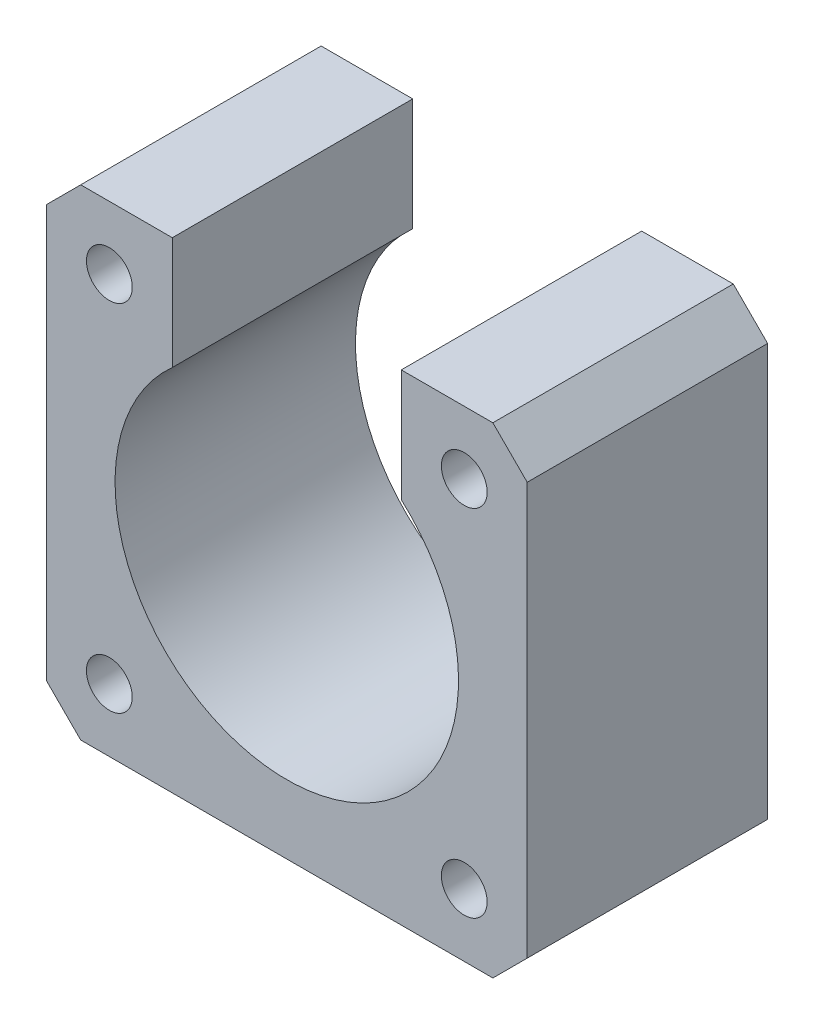
ISO-10303-21;
HEADER;
FILE_DESCRIPTION(('STEP AP214'),'2;1');
FILE_NAME('part.step','',(''),(''),'','','');
FILE_SCHEMA(('AUTOMOTIVE_DESIGN { 1 0 10303 214 1 1 1 1 }'));
ENDSEC;
DATA;
#1=APPLICATION_CONTEXT('core data for automotive mechanical design processes');
#2=APPLICATION_PROTOCOL_DEFINITION('international standard','automotive_design',2000,#1);
#3=PRODUCT_CONTEXT('',#1,'mechanical');
#4=PRODUCT('Part','Part','',(#3));
#5=PRODUCT_RELATED_PRODUCT_CATEGORY('part','',(#4));
#6=PRODUCT_DEFINITION_FORMATION('','',#4);
#7=PRODUCT_DEFINITION_CONTEXT('part definition',#1,'design');
#8=PRODUCT_DEFINITION('design','',#6,#7);
#9=PRODUCT_DEFINITION_SHAPE('','',#8);
#10=(LENGTH_UNIT() NAMED_UNIT(*) SI_UNIT(.MILLI.,.METRE.));
#11=(NAMED_UNIT(*) PLANE_ANGLE_UNIT() SI_UNIT($,.RADIAN.));
#12=(NAMED_UNIT(*) SI_UNIT($,.STERADIAN.) SOLID_ANGLE_UNIT());
#13=UNCERTAINTY_MEASURE_WITH_UNIT(LENGTH_MEASURE(1.E-05),#10,'distance_accuracy_value','');
#14=(GEOMETRIC_REPRESENTATION_CONTEXT(3) GLOBAL_UNCERTAINTY_ASSIGNED_CONTEXT((#13)) GLOBAL_UNIT_ASSIGNED_CONTEXT((#10,
#11,#12)) REPRESENTATION_CONTEXT('',''));
#15=CARTESIAN_POINT('',(0.,0.,0.));
#16=DIRECTION('',(0.,0.,1.));
#17=DIRECTION('',(1.,0.,0.));
#18=AXIS2_PLACEMENT_3D('',#15,#16,#17);
#19=CARTESIAN_POINT('',(0.,0.,21.));
#20=DIRECTION('',(0.,0.,1.));
#21=DIRECTION('',(1.,0.,0.));
#22=AXIS2_PLACEMENT_3D('',#19,#20,#21);
#23=PLANE('',#22);
#24=CARTESIAN_POINT('',(-15.5,-15.5,21.));
#25=DIRECTION('',(0.,0.,1.));
#26=DIRECTION('',(1.,0.,0.));
#27=AXIS2_PLACEMENT_3D('',#24,#25,#26);
#28=CIRCLE('',#27,2.);
#29=CARTESIAN_POINT('',(-17.5,-15.5,21.));
#30=VERTEX_POINT('',#29);
#31=EDGE_CURVE('E293',#30,#30,#28,.T.);
#32=ORIENTED_EDGE('',*,*,#31,.F.);
#33=EDGE_LOOP('',(#32));
#34=FACE_BOUND('',#33,.T.);
#35=CARTESIAN_POINT('',(15.5,15.5,21.));
#36=DIRECTION('',(0.,0.,1.));
#37=DIRECTION('',(1.,0.,0.));
#38=AXIS2_PLACEMENT_3D('',#35,#36,#37);
#39=CIRCLE('',#38,2.);
#40=CARTESIAN_POINT('',(13.5,15.5,21.));
#41=VERTEX_POINT('',#40);
#42=EDGE_CURVE('E159',#41,#41,#39,.T.);
#43=ORIENTED_EDGE('',*,*,#42,.F.);
#44=EDGE_LOOP('',(#43));
#45=FACE_BOUND('',#44,.T.);
#46=DIRECTION('',(0.,-1.,0.));
#47=VECTOR('',#46,1.);
#48=CARTESIAN_POINT('',(-21.,-18.,21.));
#49=LINE('',#48,#47);
#50=CARTESIAN_POINT('',(-21.,18.,21.));
#51=VERTEX_POINT('',#50);
#52=CARTESIAN_POINT('',(-21.,-18.,21.));
#53=VERTEX_POINT('',#52);
#54=EDGE_CURVE('E178',#51,#53,#49,.T.);
#55=ORIENTED_EDGE('',*,*,#54,.T.);
#56=DIRECTION('',(0.707106781186548,-0.707106781186548,0.));
#57=VECTOR('',#56,1.);
#58=CARTESIAN_POINT('',(-21.,-18.,21.));
#59=LINE('',#58,#57);
#60=CARTESIAN_POINT('',(-18.,-21.,21.));
#61=VERTEX_POINT('',#60);
#62=EDGE_CURVE('E106',#53,#61,#59,.T.);
#63=ORIENTED_EDGE('',*,*,#62,.T.);
#64=DIRECTION('',(1.,0.,0.));
#65=VECTOR('',#64,1.);
#66=CARTESIAN_POINT('',(-18.,-21.,21.));
#67=LINE('',#66,#65);
#68=CARTESIAN_POINT('',(18.,-21.,21.));
#69=VERTEX_POINT('',#68);
#70=EDGE_CURVE('E205',#61,#69,#67,.T.);
#71=ORIENTED_EDGE('',*,*,#70,.T.);
#72=DIRECTION('',(0.707106781186548,0.707106781186548,0.));
#73=VECTOR('',#72,1.);
#74=CARTESIAN_POINT('',(18.,-21.,21.));
#75=LINE('',#74,#73);
#76=CARTESIAN_POINT('',(21.,-18.,21.));
#77=VERTEX_POINT('',#76);
#78=EDGE_CURVE('E224',#69,#77,#75,.T.);
#79=ORIENTED_EDGE('',*,*,#78,.T.);
#80=DIRECTION('',(0.,1.,0.));
#81=VECTOR('',#80,1.);
#82=CARTESIAN_POINT('',(21.,-18.,21.));
#83=LINE('',#82,#81);
#84=CARTESIAN_POINT('',(21.,18.,21.));
#85=VERTEX_POINT('',#84);
#86=EDGE_CURVE('E221',#77,#85,#83,.T.);
#87=ORIENTED_EDGE('',*,*,#86,.T.);
#88=DIRECTION('',(-0.707106781186548,0.707106781186548,0.));
#89=VECTOR('',#88,1.);
#90=CARTESIAN_POINT('',(18.,21.,21.));
#91=LINE('',#90,#89);
#92=CARTESIAN_POINT('',(18.,21.,21.));
#93=VERTEX_POINT('',#92);
#94=EDGE_CURVE('E223',#85,#93,#91,.T.);
#95=ORIENTED_EDGE('',*,*,#94,.T.);
#96=DIRECTION('',(-1.,0.,0.));
#97=VECTOR('',#96,1.);
#98=CARTESIAN_POINT('',(10.,21.,21.));
#99=LINE('',#98,#97);
#100=CARTESIAN_POINT('',(10.,21.,21.));
#101=VERTEX_POINT('',#100);
#102=EDGE_CURVE('E226',#93,#101,#99,.T.);
#103=ORIENTED_EDGE('',*,*,#102,.T.);
#104=DIRECTION('',(0.,-1.,0.));
#105=VECTOR('',#104,1.);
#106=CARTESIAN_POINT('',(10.,21.,21.));
#107=LINE('',#106,#105);
#108=CARTESIAN_POINT('',(10.,11.180339887499,21.));
#109=VERTEX_POINT('',#108);
#110=EDGE_CURVE('E232',#101,#109,#107,.T.);
#111=ORIENTED_EDGE('',*,*,#110,.T.);
#112=CARTESIAN_POINT('',(0.,0.,21.));
#113=DIRECTION('',(0.,0.,-1.));
#114=DIRECTION('',(1.,0.,0.));
#115=AXIS2_PLACEMENT_3D('',#112,#113,#114);
#116=CIRCLE('',#115,15.);
#117=CARTESIAN_POINT('',(-10.,11.180339887499,21.));
#118=VERTEX_POINT('',#117);
#119=EDGE_CURVE('E137',#109,#118,#116,.T.);
#120=ORIENTED_EDGE('',*,*,#119,.T.);
#121=DIRECTION('',(0.,1.,0.));
#122=VECTOR('',#121,1.);
#123=CARTESIAN_POINT('',(-10.,21.,21.));
#124=LINE('',#123,#122);
#125=CARTESIAN_POINT('',(-10.,21.,21.));
#126=VERTEX_POINT('',#125);
#127=EDGE_CURVE('E131',#118,#126,#124,.T.);
#128=ORIENTED_EDGE('',*,*,#127,.T.);
#129=DIRECTION('',(-1.,0.,0.));
#130=VECTOR('',#129,1.);
#131=CARTESIAN_POINT('',(-18.,21.,21.));
#132=LINE('',#131,#130);
#133=CARTESIAN_POINT('',(-18.,21.,21.));
#134=VERTEX_POINT('',#133);
#135=EDGE_CURVE('E135',#126,#134,#132,.T.);
#136=ORIENTED_EDGE('',*,*,#135,.T.);
#137=DIRECTION('',(-0.707106781186548,-0.707106781186548,0.));
#138=VECTOR('',#137,1.);
#139=CARTESIAN_POINT('',(-21.,18.,21.));
#140=LINE('',#139,#138);
#141=EDGE_CURVE('E51',#134,#51,#140,.T.);
#142=ORIENTED_EDGE('',*,*,#141,.T.);
#143=EDGE_LOOP('',(#55,#63,#71,#79,#87,#95,#103,#111,#120,#128,#136,#142));
#144=FACE_BOUND('',#143,.T.);
#145=CARTESIAN_POINT('',(15.5,-15.5,21.));
#146=DIRECTION('',(0.,0.,1.));
#147=DIRECTION('',(1.,0.,0.));
#148=AXIS2_PLACEMENT_3D('',#145,#146,#147);
#149=CIRCLE('',#148,2.);
#150=CARTESIAN_POINT('',(13.5,-15.5,21.));
#151=VERTEX_POINT('',#150);
#152=EDGE_CURVE('E299',#151,#151,#149,.T.);
#153=ORIENTED_EDGE('',*,*,#152,.F.);
#154=EDGE_LOOP('',(#153));
#155=FACE_BOUND('',#154,.T.);
#156=CARTESIAN_POINT('',(-15.5,15.5,21.));
#157=DIRECTION('',(0.,0.,1.));
#158=DIRECTION('',(1.,0.,0.));
#159=AXIS2_PLACEMENT_3D('',#156,#157,#158);
#160=CIRCLE('',#159,2.);
#161=CARTESIAN_POINT('',(-17.5,15.5,21.));
#162=VERTEX_POINT('',#161);
#163=EDGE_CURVE('E284',#162,#162,#160,.T.);
#164=ORIENTED_EDGE('',*,*,#163,.F.);
#165=EDGE_LOOP('',(#164));
#166=FACE_BOUND('',#165,.T.);
#167=ADVANCED_FACE('F34',(#34,#45,#144,#155,#166),#23,.T.);
#168=CARTESIAN_POINT('',(0.,0.,0.));
#169=DIRECTION('',(0.,0.,1.));
#170=DIRECTION('',(1.,0.,0.));
#171=AXIS2_PLACEMENT_3D('',#168,#169,#170);
#172=PLANE('',#171);
#173=CARTESIAN_POINT('',(-15.5,-15.5,0.));
#174=DIRECTION('',(0.,0.,1.));
#175=DIRECTION('',(1.,0.,0.));
#176=AXIS2_PLACEMENT_3D('',#173,#174,#175);
#177=CIRCLE('',#176,2.);
#178=CARTESIAN_POINT('',(-17.5,-15.5,0.));
#179=VERTEX_POINT('',#178);
#180=EDGE_CURVE('E290',#179,#179,#177,.T.);
#181=ORIENTED_EDGE('',*,*,#180,.T.);
#182=EDGE_LOOP('',(#181));
#183=FACE_BOUND('',#182,.T.);
#184=CARTESIAN_POINT('',(15.5,15.5,0.));
#185=DIRECTION('',(0.,0.,1.));
#186=DIRECTION('',(1.,0.,0.));
#187=AXIS2_PLACEMENT_3D('',#184,#185,#186);
#188=CIRCLE('',#187,2.);
#189=CARTESIAN_POINT('',(13.5,15.5,0.));
#190=VERTEX_POINT('',#189);
#191=EDGE_CURVE('E302',#190,#190,#188,.T.);
#192=ORIENTED_EDGE('',*,*,#191,.T.);
#193=EDGE_LOOP('',(#192));
#194=FACE_BOUND('',#193,.T.);
#195=DIRECTION('',(0.,-1.,0.));
#196=VECTOR('',#195,1.);
#197=CARTESIAN_POINT('',(-21.,-18.,0.));
#198=LINE('',#197,#196);
#199=CARTESIAN_POINT('',(-21.,18.,0.));
#200=VERTEX_POINT('',#199);
#201=CARTESIAN_POINT('',(-21.,-18.,0.));
#202=VERTEX_POINT('',#201);
#203=EDGE_CURVE('E155',#200,#202,#198,.T.);
#204=ORIENTED_EDGE('',*,*,#203,.F.);
#205=DIRECTION('',(-0.707106781186548,-0.707106781186548,0.));
#206=VECTOR('',#205,1.);
#207=CARTESIAN_POINT('',(-21.,18.,0.));
#208=LINE('',#207,#206);
#209=CARTESIAN_POINT('',(-18.,21.,0.));
#210=VERTEX_POINT('',#209);
#211=EDGE_CURVE('E98',#210,#200,#208,.T.);
#212=ORIENTED_EDGE('',*,*,#211,.F.);
#213=DIRECTION('',(-1.,0.,0.));
#214=VECTOR('',#213,1.);
#215=CARTESIAN_POINT('',(-18.,21.,0.));
#216=LINE('',#215,#214);
#217=CARTESIAN_POINT('',(-10.,21.,0.));
#218=VERTEX_POINT('',#217);
#219=EDGE_CURVE('E92',#218,#210,#216,.T.);
#220=ORIENTED_EDGE('',*,*,#219,.F.);
#221=DIRECTION('',(0.,1.,0.));
#222=VECTOR('',#221,1.);
#223=CARTESIAN_POINT('',(-10.,21.,0.));
#224=LINE('',#223,#222);
#225=CARTESIAN_POINT('',(-10.,11.180339887499,0.));
#226=VERTEX_POINT('',#225);
#227=EDGE_CURVE('E145',#226,#218,#224,.T.);
#228=ORIENTED_EDGE('',*,*,#227,.F.);
#229=CARTESIAN_POINT('',(0.,0.,0.));
#230=DIRECTION('',(0.,0.,-1.));
#231=DIRECTION('',(1.,0.,0.));
#232=AXIS2_PLACEMENT_3D('',#229,#230,#231);
#233=CIRCLE('',#232,15.);
#234=CARTESIAN_POINT('',(10.,11.180339887499,0.));
#235=VERTEX_POINT('',#234);
#236=EDGE_CURVE('E173',#235,#226,#233,.T.);
#237=ORIENTED_EDGE('',*,*,#236,.F.);
#238=DIRECTION('',(0.,-1.,0.));
#239=VECTOR('',#238,1.);
#240=CARTESIAN_POINT('',(10.,21.,0.));
#241=LINE('',#240,#239);
#242=CARTESIAN_POINT('',(10.,21.,0.));
#243=VERTEX_POINT('',#242);
#244=EDGE_CURVE('E171',#243,#235,#241,.T.);
#245=ORIENTED_EDGE('',*,*,#244,.F.);
#246=DIRECTION('',(-1.,0.,0.));
#247=VECTOR('',#246,1.);
#248=CARTESIAN_POINT('',(10.,21.,0.));
#249=LINE('',#248,#247);
#250=CARTESIAN_POINT('',(18.,21.,0.));
#251=VERTEX_POINT('',#250);
#252=EDGE_CURVE('E169',#251,#243,#249,.T.);
#253=ORIENTED_EDGE('',*,*,#252,.F.);
#254=DIRECTION('',(-0.707106781186548,0.707106781186548,0.));
#255=VECTOR('',#254,1.);
#256=CARTESIAN_POINT('',(18.,21.,0.));
#257=LINE('',#256,#255);
#258=CARTESIAN_POINT('',(21.,18.,0.));
#259=VERTEX_POINT('',#258);
#260=EDGE_CURVE('E167',#259,#251,#257,.T.);
#261=ORIENTED_EDGE('',*,*,#260,.F.);
#262=DIRECTION('',(0.,1.,0.));
#263=VECTOR('',#262,1.);
#264=CARTESIAN_POINT('',(21.,-18.,0.));
#265=LINE('',#264,#263);
#266=CARTESIAN_POINT('',(21.,-18.,0.));
#267=VERTEX_POINT('',#266);
#268=EDGE_CURVE('E165',#267,#259,#265,.T.);
#269=ORIENTED_EDGE('',*,*,#268,.F.);
#270=DIRECTION('',(0.707106781186548,0.707106781186548,0.));
#271=VECTOR('',#270,1.);
#272=CARTESIAN_POINT('',(18.,-21.,0.));
#273=LINE('',#272,#271);
#274=CARTESIAN_POINT('',(18.,-21.,0.));
#275=VERTEX_POINT('',#274);
#276=EDGE_CURVE('E163',#275,#267,#273,.T.);
#277=ORIENTED_EDGE('',*,*,#276,.F.);
#278=DIRECTION('',(1.,0.,0.));
#279=VECTOR('',#278,1.);
#280=CARTESIAN_POINT('',(-18.,-21.,0.));
#281=LINE('',#280,#279);
#282=CARTESIAN_POINT('',(-18.,-21.,0.));
#283=VERTEX_POINT('',#282);
#284=EDGE_CURVE('E161',#283,#275,#281,.T.);
#285=ORIENTED_EDGE('',*,*,#284,.F.);
#286=DIRECTION('',(0.707106781186548,-0.707106781186548,0.));
#287=VECTOR('',#286,1.);
#288=CARTESIAN_POINT('',(-21.,-18.,0.));
#289=LINE('',#288,#287);
#290=EDGE_CURVE('E158',#202,#283,#289,.T.);
#291=ORIENTED_EDGE('',*,*,#290,.F.);
#292=EDGE_LOOP('',(#204,#212,#220,#228,#237,#245,#253,#261,#269,#277,#285,#291));
#293=FACE_BOUND('',#292,.T.);
#294=CARTESIAN_POINT('',(15.5,-15.5,0.));
#295=DIRECTION('',(0.,0.,1.));
#296=DIRECTION('',(1.,0.,0.));
#297=AXIS2_PLACEMENT_3D('',#294,#295,#296);
#298=CIRCLE('',#297,2.);
#299=CARTESIAN_POINT('',(13.5,-15.5,0.));
#300=VERTEX_POINT('',#299);
#301=EDGE_CURVE('E296',#300,#300,#298,.T.);
#302=ORIENTED_EDGE('',*,*,#301,.T.);
#303=EDGE_LOOP('',(#302));
#304=FACE_BOUND('',#303,.T.);
#305=CARTESIAN_POINT('',(-15.5,15.5,0.));
#306=DIRECTION('',(0.,0.,1.));
#307=DIRECTION('',(1.,0.,0.));
#308=AXIS2_PLACEMENT_3D('',#305,#306,#307);
#309=CIRCLE('',#308,2.);
#310=CARTESIAN_POINT('',(-17.5,15.5,0.));
#311=VERTEX_POINT('',#310);
#312=EDGE_CURVE('E287',#311,#311,#309,.T.);
#313=ORIENTED_EDGE('',*,*,#312,.T.);
#314=EDGE_LOOP('',(#313));
#315=FACE_BOUND('',#314,.T.);
#316=ADVANCED_FACE('F209',(#183,#194,#293,#304,#315),#172,.F.);
#317=CARTESIAN_POINT('',(-21.,-18.,21.));
#318=DIRECTION('',(1.,0.,0.));
#319=DIRECTION('',(0.,0.,-1.));
#320=AXIS2_PLACEMENT_3D('',#317,#318,#319);
#321=PLANE('',#320);
#322=ORIENTED_EDGE('',*,*,#203,.T.);
#323=DIRECTION('',(0.,0.,-1.));
#324=VECTOR('',#323,1.);
#325=CARTESIAN_POINT('',(-21.,-18.,21.));
#326=LINE('',#325,#324);
#327=EDGE_CURVE('E11',#53,#202,#326,.T.);
#328=ORIENTED_EDGE('',*,*,#327,.F.);
#329=ORIENTED_EDGE('',*,*,#54,.F.);
#330=DIRECTION('',(0.,0.,-1.));
#331=VECTOR('',#330,1.);
#332=CARTESIAN_POINT('',(-21.,18.,21.));
#333=LINE('',#332,#331);
#334=EDGE_CURVE('E151',#51,#200,#333,.T.);
#335=ORIENTED_EDGE('',*,*,#334,.T.);
#336=EDGE_LOOP('',(#322,#328,#329,#335));
#337=FACE_BOUND('',#336,.T.);
#338=ADVANCED_FACE('F36',(#337),#321,.F.);
#339=CARTESIAN_POINT('',(-21.,-18.,21.));
#340=DIRECTION('',(0.707106781186547,0.707106781186547,0.));
#341=DIRECTION('',(-0.707106781186548,0.707106781186548,0.));
#342=AXIS2_PLACEMENT_3D('',#339,#340,#341);
#343=PLANE('',#342);
#344=ORIENTED_EDGE('',*,*,#290,.T.);
#345=DIRECTION('',(0.,0.,-1.));
#346=VECTOR('',#345,1.);
#347=CARTESIAN_POINT('',(-18.,-21.,21.));
#348=LINE('',#347,#346);
#349=EDGE_CURVE('E43',#61,#283,#348,.T.);
#350=ORIENTED_EDGE('',*,*,#349,.F.);
#351=ORIENTED_EDGE('',*,*,#62,.F.);
#352=ORIENTED_EDGE('',*,*,#327,.T.);
#353=EDGE_LOOP('',(#344,#350,#351,#352));
#354=FACE_BOUND('',#353,.T.);
#355=ADVANCED_FACE('F411',(#354),#343,.F.);
#356=CARTESIAN_POINT('',(-18.,-21.,21.));
#357=DIRECTION('',(0.,1.,0.));
#358=DIRECTION('',(0.,0.,1.));
#359=AXIS2_PLACEMENT_3D('',#356,#357,#358);
#360=PLANE('',#359);
#361=ORIENTED_EDGE('',*,*,#284,.T.);
#362=DIRECTION('',(0.,0.,-1.));
#363=VECTOR('',#362,1.);
#364=CARTESIAN_POINT('',(18.,-21.,21.));
#365=LINE('',#364,#363);
#366=EDGE_CURVE('E197',#69,#275,#365,.T.);
#367=ORIENTED_EDGE('',*,*,#366,.F.);
#368=ORIENTED_EDGE('',*,*,#70,.F.);
#369=ORIENTED_EDGE('',*,*,#349,.T.);
#370=EDGE_LOOP('',(#361,#367,#368,#369));
#371=FACE_BOUND('',#370,.T.);
#372=ADVANCED_FACE('F203',(#371),#360,.F.);
#373=CARTESIAN_POINT('',(18.,-21.,21.));
#374=DIRECTION('',(-0.707106781186547,0.707106781186547,0.));
#375=DIRECTION('',(-0.707106781186548,-0.707106781186548,0.));
#376=AXIS2_PLACEMENT_3D('',#373,#374,#375);
#377=PLANE('',#376);
#378=ORIENTED_EDGE('',*,*,#276,.T.);
#379=DIRECTION('',(0.,0.,-1.));
#380=VECTOR('',#379,1.);
#381=CARTESIAN_POINT('',(21.,-18.,21.));
#382=LINE('',#381,#380);
#383=EDGE_CURVE('E194',#77,#267,#382,.T.);
#384=ORIENTED_EDGE('',*,*,#383,.F.);
#385=ORIENTED_EDGE('',*,*,#78,.F.);
#386=ORIENTED_EDGE('',*,*,#366,.T.);
#387=EDGE_LOOP('',(#378,#384,#385,#386));
#388=FACE_BOUND('',#387,.T.);
#389=ADVANCED_FACE('F215',(#388),#377,.F.);
#390=CARTESIAN_POINT('',(21.,-18.,21.));
#391=DIRECTION('',(-1.,0.,0.));
#392=DIRECTION('',(0.,0.,1.));
#393=AXIS2_PLACEMENT_3D('',#390,#391,#392);
#394=PLANE('',#393);
#395=ORIENTED_EDGE('',*,*,#268,.T.);
#396=DIRECTION('',(0.,0.,-1.));
#397=VECTOR('',#396,1.);
#398=CARTESIAN_POINT('',(21.,18.,21.));
#399=LINE('',#398,#397);
#400=EDGE_CURVE('E191',#85,#259,#399,.T.);
#401=ORIENTED_EDGE('',*,*,#400,.F.);
#402=ORIENTED_EDGE('',*,*,#86,.F.);
#403=ORIENTED_EDGE('',*,*,#383,.T.);
#404=EDGE_LOOP('',(#395,#401,#402,#403));
#405=FACE_BOUND('',#404,.T.);
#406=ADVANCED_FACE('F219',(#405),#394,.F.);
#407=CARTESIAN_POINT('',(18.,21.,21.));
#408=DIRECTION('',(-0.707106781186547,-0.707106781186547,0.));
#409=DIRECTION('',(0.707106781186548,-0.707106781186548,0.));
#410=AXIS2_PLACEMENT_3D('',#407,#408,#409);
#411=PLANE('',#410);
#412=ORIENTED_EDGE('',*,*,#260,.T.);
#413=DIRECTION('',(0.,0.,-1.));
#414=VECTOR('',#413,1.);
#415=CARTESIAN_POINT('',(18.,21.,21.));
#416=LINE('',#415,#414);
#417=EDGE_CURVE('E188',#93,#251,#416,.T.);
#418=ORIENTED_EDGE('',*,*,#417,.F.);
#419=ORIENTED_EDGE('',*,*,#94,.F.);
#420=ORIENTED_EDGE('',*,*,#400,.T.);
#421=EDGE_LOOP('',(#412,#418,#419,#420));
#422=FACE_BOUND('',#421,.T.);
#423=ADVANCED_FACE('F376',(#422),#411,.F.);
#424=CARTESIAN_POINT('',(10.,21.,21.));
#425=DIRECTION('',(0.,-1.,0.));
#426=DIRECTION('',(0.,0.,-1.));
#427=AXIS2_PLACEMENT_3D('',#424,#425,#426);
#428=PLANE('',#427);
#429=ORIENTED_EDGE('',*,*,#252,.T.);
#430=DIRECTION('',(0.,0.,-1.));
#431=VECTOR('',#430,1.);
#432=CARTESIAN_POINT('',(10.,21.,21.));
#433=LINE('',#432,#431);
#434=EDGE_CURVE('E185',#101,#243,#433,.T.);
#435=ORIENTED_EDGE('',*,*,#434,.F.);
#436=ORIENTED_EDGE('',*,*,#102,.F.);
#437=ORIENTED_EDGE('',*,*,#417,.T.);
#438=EDGE_LOOP('',(#429,#435,#436,#437));
#439=FACE_BOUND('',#438,.T.);
#440=ADVANCED_FACE('F367',(#439),#428,.F.);
#441=CARTESIAN_POINT('',(10.,21.,21.));
#442=DIRECTION('',(1.,0.,0.));
#443=DIRECTION('',(0.,0.,-1.));
#444=AXIS2_PLACEMENT_3D('',#441,#442,#443);
#445=PLANE('',#444);
#446=ORIENTED_EDGE('',*,*,#244,.T.);
#447=DIRECTION('',(0.,0.,-1.));
#448=VECTOR('',#447,1.);
#449=CARTESIAN_POINT('',(10.,11.180339887499,21.));
#450=LINE('',#449,#448);
#451=EDGE_CURVE('E182',#109,#235,#450,.T.);
#452=ORIENTED_EDGE('',*,*,#451,.F.);
#453=ORIENTED_EDGE('',*,*,#110,.F.);
#454=ORIENTED_EDGE('',*,*,#434,.T.);
#455=EDGE_LOOP('',(#446,#452,#453,#454));
#456=FACE_BOUND('',#455,.T.);
#457=ADVANCED_FACE('F238',(#456),#445,.F.);
#458=CARTESIAN_POINT('',(0.,0.,21.));
#459=DIRECTION('',(0.,0.,-1.));
#460=DIRECTION('',(-1.,0.,0.));
#461=AXIS2_PLACEMENT_3D('',#458,#459,#460);
#462=CYLINDRICAL_SURFACE('',#461,15.);
#463=ORIENTED_EDGE('',*,*,#236,.T.);
#464=DIRECTION('',(0.,0.,-1.));
#465=VECTOR('',#464,1.);
#466=CARTESIAN_POINT('',(-10.,11.180339887499,21.));
#467=LINE('',#466,#465);
#468=EDGE_CURVE('E146',#118,#226,#467,.T.);
#469=ORIENTED_EDGE('',*,*,#468,.F.);
#470=ORIENTED_EDGE('',*,*,#119,.F.);
#471=ORIENTED_EDGE('',*,*,#451,.T.);
#472=EDGE_LOOP('',(#463,#469,#470,#471));
#473=FACE_BOUND('',#472,.T.);
#474=ADVANCED_FACE('F242',(#473),#462,.F.);
#475=CARTESIAN_POINT('',(-10.,21.,21.));
#476=DIRECTION('',(-1.,0.,0.));
#477=DIRECTION('',(0.,0.,1.));
#478=AXIS2_PLACEMENT_3D('',#475,#476,#477);
#479=PLANE('',#478);
#480=ORIENTED_EDGE('',*,*,#227,.T.);
#481=DIRECTION('',(0.,0.,-1.));
#482=VECTOR('',#481,1.);
#483=CARTESIAN_POINT('',(-10.,21.,21.));
#484=LINE('',#483,#482);
#485=EDGE_CURVE('E142',#126,#218,#484,.T.);
#486=ORIENTED_EDGE('',*,*,#485,.F.);
#487=ORIENTED_EDGE('',*,*,#127,.F.);
#488=ORIENTED_EDGE('',*,*,#468,.T.);
#489=EDGE_LOOP('',(#480,#486,#487,#488));
#490=FACE_BOUND('',#489,.T.);
#491=ADVANCED_FACE('F143',(#490),#479,.F.);
#492=CARTESIAN_POINT('',(-18.,21.,21.));
#493=DIRECTION('',(0.,-1.,0.));
#494=DIRECTION('',(0.,0.,-1.));
#495=AXIS2_PLACEMENT_3D('',#492,#493,#494);
#496=PLANE('',#495);
#497=ORIENTED_EDGE('',*,*,#219,.T.);
#498=DIRECTION('',(0.,0.,-1.));
#499=VECTOR('',#498,1.);
#500=CARTESIAN_POINT('',(-18.,21.,21.));
#501=LINE('',#500,#499);
#502=EDGE_CURVE('E147',#134,#210,#501,.T.);
#503=ORIENTED_EDGE('',*,*,#502,.F.);
#504=ORIENTED_EDGE('',*,*,#135,.F.);
#505=ORIENTED_EDGE('',*,*,#485,.T.);
#506=EDGE_LOOP('',(#497,#503,#504,#505));
#507=FACE_BOUND('',#506,.T.);
#508=ADVANCED_FACE('F149',(#507),#496,.F.);
#509=CARTESIAN_POINT('',(-21.,18.,21.));
#510=DIRECTION('',(0.707106781186547,-0.707106781186547,0.));
#511=DIRECTION('',(0.707106781186548,0.707106781186548,0.));
#512=AXIS2_PLACEMENT_3D('',#509,#510,#511);
#513=PLANE('',#512);
#514=ORIENTED_EDGE('',*,*,#211,.T.);
#515=ORIENTED_EDGE('',*,*,#334,.F.);
#516=ORIENTED_EDGE('',*,*,#141,.F.);
#517=ORIENTED_EDGE('',*,*,#502,.T.);
#518=EDGE_LOOP('',(#514,#515,#516,#517));
#519=FACE_BOUND('',#518,.T.);
#520=ADVANCED_FACE('F246',(#519),#513,.F.);
#521=CARTESIAN_POINT('',(15.5,15.5,21.));
#522=DIRECTION('',(0.,0.,-1.));
#523=DIRECTION('',(-1.,0.,0.));
#524=AXIS2_PLACEMENT_3D('',#521,#522,#523);
#525=CYLINDRICAL_SURFACE('',#524,2.);
#526=CARTESIAN_POINT('',(13.5,15.5,21.));
#527=CARTESIAN_POINT('',(13.5,15.5,20.78125));
#528=CARTESIAN_POINT('',(13.5,15.5,20.5625));
#529=CARTESIAN_POINT('',(13.5,15.5,20.125));
#530=CARTESIAN_POINT('',(13.5,15.5,19.90625));
#531=CARTESIAN_POINT('',(13.5,15.5,19.46875));
#532=CARTESIAN_POINT('',(13.5,15.5,19.25));
#533=CARTESIAN_POINT('',(13.5,15.5,18.8125));
#534=CARTESIAN_POINT('',(13.5,15.5,18.59375));
#535=CARTESIAN_POINT('',(13.5,15.5,18.15625));
#536=CARTESIAN_POINT('',(13.5,15.5,17.9375));
#537=CARTESIAN_POINT('',(13.5,15.5,17.5));
#538=CARTESIAN_POINT('',(13.5,15.5,17.28125));
#539=CARTESIAN_POINT('',(13.5,15.5,16.84375));
#540=CARTESIAN_POINT('',(13.5,15.5,16.625));
#541=CARTESIAN_POINT('',(13.5,15.5,16.1875));
#542=CARTESIAN_POINT('',(13.5,15.5,15.96875));
#543=CARTESIAN_POINT('',(13.5,15.5,15.53125));
#544=CARTESIAN_POINT('',(13.5,15.5,15.3125));
#545=CARTESIAN_POINT('',(13.5,15.5,14.875));
#546=CARTESIAN_POINT('',(13.5,15.5,14.65625));
#547=CARTESIAN_POINT('',(13.5,15.5,14.21875));
#548=CARTESIAN_POINT('',(13.5,15.5,14.));
#549=CARTESIAN_POINT('',(13.5,15.5,13.5625));
#550=CARTESIAN_POINT('',(13.5,15.5,13.34375));
#551=CARTESIAN_POINT('',(13.5,15.5,12.90625));
#552=CARTESIAN_POINT('',(13.5,15.5,12.6875));
#553=CARTESIAN_POINT('',(13.5,15.5,12.25));
#554=CARTESIAN_POINT('',(13.5,15.5,12.03125));
#555=CARTESIAN_POINT('',(13.5,15.5,11.59375));
#556=CARTESIAN_POINT('',(13.5,15.5,11.375));
#557=CARTESIAN_POINT('',(13.5,15.5,10.9375));
#558=CARTESIAN_POINT('',(13.5,15.5,10.71875));
#559=CARTESIAN_POINT('',(13.5,15.5,10.28125));
#560=CARTESIAN_POINT('',(13.5,15.5,10.0625));
#561=CARTESIAN_POINT('',(13.5,15.5,9.625));
#562=CARTESIAN_POINT('',(13.5,15.5,9.40625));
#563=CARTESIAN_POINT('',(13.5,15.5,8.96875));
#564=CARTESIAN_POINT('',(13.5,15.5,8.75));
#565=CARTESIAN_POINT('',(13.5,15.5,8.3125));
#566=CARTESIAN_POINT('',(13.5,15.5,8.09375));
#567=CARTESIAN_POINT('',(13.5,15.5,7.65625));
#568=CARTESIAN_POINT('',(13.5,15.5,7.4375));
#569=CARTESIAN_POINT('',(13.5,15.5,7.));
#570=CARTESIAN_POINT('',(13.5,15.5,6.78125));
#571=CARTESIAN_POINT('',(13.5,15.5,6.34375));
#572=CARTESIAN_POINT('',(13.5,15.5,6.125));
#573=CARTESIAN_POINT('',(13.5,15.5,5.6875));
#574=CARTESIAN_POINT('',(13.5,15.5,5.46875));
#575=CARTESIAN_POINT('',(13.5,15.5,5.03125));
#576=CARTESIAN_POINT('',(13.5,15.5,4.8125));
#577=CARTESIAN_POINT('',(13.5,15.5,4.375));
#578=CARTESIAN_POINT('',(13.5,15.5,4.15625));
#579=CARTESIAN_POINT('',(13.5,15.5,3.71875));
#580=CARTESIAN_POINT('',(13.5,15.5,3.5));
#581=CARTESIAN_POINT('',(13.5,15.5,3.0625));
#582=CARTESIAN_POINT('',(13.5,15.5,2.84375));
#583=CARTESIAN_POINT('',(13.5,15.5,2.40625));
#584=CARTESIAN_POINT('',(13.5,15.5,2.1875));
#585=CARTESIAN_POINT('',(13.5,15.5,1.75));
#586=CARTESIAN_POINT('',(13.5,15.5,1.53125));
#587=CARTESIAN_POINT('',(13.5,15.5,1.09375));
#588=CARTESIAN_POINT('',(13.5,15.5,0.875000000000001));
#589=CARTESIAN_POINT('',(13.5,15.5,0.4375));
#590=CARTESIAN_POINT('',(13.5,15.5,0.21875));
#591=CARTESIAN_POINT('',(13.5,15.5,0.));
#592=B_SPLINE_CURVE_WITH_KNOTS('',3,(#526,#527,#528,#529,#530,#531,#532,#533,#534,#535,#536,
#537,#538,#539,#540,#541,#542,#543,#544,#545,#546,#547,#548,#549,#550,#551,#552,#553,#554,#555,
#556,#557,#558,#559,#560,#561,#562,#563,#564,#565,#566,#567,#568,#569,#570,#571,#572,#573,#574,
#575,#576,#577,#578,#579,#580,#581,#582,#583,#584,#585,#586,#587,#588,#589,#590,#591),
.UNSPECIFIED.,.F.,.F.,(4,2,2,2,2,2,2,2,2,2,2,2,2,2,2,2,2,2,2,2,2,2,2,2,2,2,2,2,2,2,2,2,4),(0.,
0.656250000000001,1.3125,1.96875,2.625,3.28125,3.9375,4.59375,5.25,5.90625,6.5625,7.21875,7.875,
8.53125,9.1875,9.84375,10.5,11.15625,11.8125,12.46875,13.125,13.78125,14.4375,15.09375,15.75,
16.40625,17.0625,17.71875,18.375,19.03125,19.6875,20.34375,21.),.UNSPECIFIED.);
#593=EDGE_CURVE('BSEAM248',#41,#190,#592,.T.);
#594=ORIENTED_EDGE('',*,*,#42,.T.);
#595=ORIENTED_EDGE('',*,*,#191,.F.);
#596=ORIENTED_EDGE('',*,*,#593,.T.);
#597=ORIENTED_EDGE('',*,*,#593,.F.);
#598=EDGE_LOOP('',(#594,#596,#595,#597));
#599=FACE_BOUND('',#598,.T.);
#600=ADVANCED_FACE('F248',(#599),#525,.F.);
#601=CARTESIAN_POINT('',(15.5,-15.5,21.));
#602=DIRECTION('',(0.,0.,-1.));
#603=DIRECTION('',(-1.,0.,0.));
#604=AXIS2_PLACEMENT_3D('',#601,#602,#603);
#605=CYLINDRICAL_SURFACE('',#604,2.);
#606=CARTESIAN_POINT('',(13.5,-15.5,21.));
#607=CARTESIAN_POINT('',(13.5,-15.5,20.78125));
#608=CARTESIAN_POINT('',(13.5,-15.5,20.5625));
#609=CARTESIAN_POINT('',(13.5,-15.5,20.125));
#610=CARTESIAN_POINT('',(13.5,-15.5,19.90625));
#611=CARTESIAN_POINT('',(13.5,-15.5,19.46875));
#612=CARTESIAN_POINT('',(13.5,-15.5,19.25));
#613=CARTESIAN_POINT('',(13.5,-15.5,18.8125));
#614=CARTESIAN_POINT('',(13.5,-15.5,18.59375));
#615=CARTESIAN_POINT('',(13.5,-15.5,18.15625));
#616=CARTESIAN_POINT('',(13.5,-15.5,17.9375));
#617=CARTESIAN_POINT('',(13.5,-15.5,17.5));
#618=CARTESIAN_POINT('',(13.5,-15.5,17.28125));
#619=CARTESIAN_POINT('',(13.5,-15.5,16.84375));
#620=CARTESIAN_POINT('',(13.5,-15.5,16.625));
#621=CARTESIAN_POINT('',(13.5,-15.5,16.1875));
#622=CARTESIAN_POINT('',(13.5,-15.5,15.96875));
#623=CARTESIAN_POINT('',(13.5,-15.5,15.53125));
#624=CARTESIAN_POINT('',(13.5,-15.5,15.3125));
#625=CARTESIAN_POINT('',(13.5,-15.5,14.875));
#626=CARTESIAN_POINT('',(13.5,-15.5,14.65625));
#627=CARTESIAN_POINT('',(13.5,-15.5,14.21875));
#628=CARTESIAN_POINT('',(13.5,-15.5,14.));
#629=CARTESIAN_POINT('',(13.5,-15.5,13.5625));
#630=CARTESIAN_POINT('',(13.5,-15.5,13.34375));
#631=CARTESIAN_POINT('',(13.5,-15.5,12.90625));
#632=CARTESIAN_POINT('',(13.5,-15.5,12.6875));
#633=CARTESIAN_POINT('',(13.5,-15.5,12.25));
#634=CARTESIAN_POINT('',(13.5,-15.5,12.03125));
#635=CARTESIAN_POINT('',(13.5,-15.5,11.59375));
#636=CARTESIAN_POINT('',(13.5,-15.5,11.375));
#637=CARTESIAN_POINT('',(13.5,-15.5,10.9375));
#638=CARTESIAN_POINT('',(13.5,-15.5,10.71875));
#639=CARTESIAN_POINT('',(13.5,-15.5,10.28125));
#640=CARTESIAN_POINT('',(13.5,-15.5,10.0625));
#641=CARTESIAN_POINT('',(13.5,-15.5,9.625));
#642=CARTESIAN_POINT('',(13.5,-15.5,9.40625));
#643=CARTESIAN_POINT('',(13.5,-15.5,8.96875));
#644=CARTESIAN_POINT('',(13.5,-15.5,8.75));
#645=CARTESIAN_POINT('',(13.5,-15.5,8.3125));
#646=CARTESIAN_POINT('',(13.5,-15.5,8.09375));
#647=CARTESIAN_POINT('',(13.5,-15.5,7.65625));
#648=CARTESIAN_POINT('',(13.5,-15.5,7.4375));
#649=CARTESIAN_POINT('',(13.5,-15.5,7.));
#650=CARTESIAN_POINT('',(13.5,-15.5,6.78125));
#651=CARTESIAN_POINT('',(13.5,-15.5,6.34375));
#652=CARTESIAN_POINT('',(13.5,-15.5,6.125));
#653=CARTESIAN_POINT('',(13.5,-15.5,5.6875));
#654=CARTESIAN_POINT('',(13.5,-15.5,5.46875));
#655=CARTESIAN_POINT('',(13.5,-15.5,5.03125));
#656=CARTESIAN_POINT('',(13.5,-15.5,4.8125));
#657=CARTESIAN_POINT('',(13.5,-15.5,4.375));
#658=CARTESIAN_POINT('',(13.5,-15.5,4.15625));
#659=CARTESIAN_POINT('',(13.5,-15.5,3.71875));
#660=CARTESIAN_POINT('',(13.5,-15.5,3.5));
#661=CARTESIAN_POINT('',(13.5,-15.5,3.0625));
#662=CARTESIAN_POINT('',(13.5,-15.5,2.84375));
#663=CARTESIAN_POINT('',(13.5,-15.5,2.40625));
#664=CARTESIAN_POINT('',(13.5,-15.5,2.1875));
#665=CARTESIAN_POINT('',(13.5,-15.5,1.75));
#666=CARTESIAN_POINT('',(13.5,-15.5,1.53125));
#667=CARTESIAN_POINT('',(13.5,-15.5,1.09375));
#668=CARTESIAN_POINT('',(13.5,-15.5,0.875000000000001));
#669=CARTESIAN_POINT('',(13.5,-15.5,0.4375));
#670=CARTESIAN_POINT('',(13.5,-15.5,0.21875));
#671=CARTESIAN_POINT('',(13.5,-15.5,0.));
#672=B_SPLINE_CURVE_WITH_KNOTS('',3,(#606,#607,#608,#609,#610,#611,#612,#613,#614,#615,#616,
#617,#618,#619,#620,#621,#622,#623,#624,#625,#626,#627,#628,#629,#630,#631,#632,#633,#634,#635,
#636,#637,#638,#639,#640,#641,#642,#643,#644,#645,#646,#647,#648,#649,#650,#651,#652,#653,#654,
#655,#656,#657,#658,#659,#660,#661,#662,#663,#664,#665,#666,#667,#668,#669,#670,#671),
.UNSPECIFIED.,.F.,.F.,(4,2,2,2,2,2,2,2,2,2,2,2,2,2,2,2,2,2,2,2,2,2,2,2,2,2,2,2,2,2,2,2,4),(0.,
0.656250000000001,1.3125,1.96875,2.625,3.28125,3.9375,4.59375,5.25,5.90625,6.5625,7.21875,7.875,
8.53125,9.1875,9.84375,10.5,11.15625,11.8125,12.46875,13.125,13.78125,14.4375,15.09375,15.75,
16.40625,17.0625,17.71875,18.375,19.03125,19.6875,20.34375,21.),.UNSPECIFIED.);
#673=EDGE_CURVE('BSEAM254',#151,#300,#672,.T.);
#674=ORIENTED_EDGE('',*,*,#152,.T.);
#675=ORIENTED_EDGE('',*,*,#301,.F.);
#676=ORIENTED_EDGE('',*,*,#673,.T.);
#677=ORIENTED_EDGE('',*,*,#673,.F.);
#678=EDGE_LOOP('',(#674,#676,#675,#677));
#679=FACE_BOUND('',#678,.T.);
#680=ADVANCED_FACE('F254',(#679),#605,.F.);
#681=CARTESIAN_POINT('',(-15.5,-15.5,21.));
#682=DIRECTION('',(0.,0.,-1.));
#683=DIRECTION('',(-1.,0.,0.));
#684=AXIS2_PLACEMENT_3D('',#681,#682,#683);
#685=CYLINDRICAL_SURFACE('',#684,2.);
#686=CARTESIAN_POINT('',(-17.5,-15.5,21.));
#687=CARTESIAN_POINT('',(-17.5,-15.5,20.78125));
#688=CARTESIAN_POINT('',(-17.5,-15.5,20.5625));
#689=CARTESIAN_POINT('',(-17.5,-15.5,20.125));
#690=CARTESIAN_POINT('',(-17.5,-15.5,19.90625));
#691=CARTESIAN_POINT('',(-17.5,-15.5,19.46875));
#692=CARTESIAN_POINT('',(-17.5,-15.5,19.25));
#693=CARTESIAN_POINT('',(-17.5,-15.5,18.8125));
#694=CARTESIAN_POINT('',(-17.5,-15.5,18.59375));
#695=CARTESIAN_POINT('',(-17.5,-15.5,18.15625));
#696=CARTESIAN_POINT('',(-17.5,-15.5,17.9375));
#697=CARTESIAN_POINT('',(-17.5,-15.5,17.5));
#698=CARTESIAN_POINT('',(-17.5,-15.5,17.28125));
#699=CARTESIAN_POINT('',(-17.5,-15.5,16.84375));
#700=CARTESIAN_POINT('',(-17.5,-15.5,16.625));
#701=CARTESIAN_POINT('',(-17.5,-15.5,16.1875));
#702=CARTESIAN_POINT('',(-17.5,-15.5,15.96875));
#703=CARTESIAN_POINT('',(-17.5,-15.5,15.53125));
#704=CARTESIAN_POINT('',(-17.5,-15.5,15.3125));
#705=CARTESIAN_POINT('',(-17.5,-15.5,14.875));
#706=CARTESIAN_POINT('',(-17.5,-15.5,14.65625));
#707=CARTESIAN_POINT('',(-17.5,-15.5,14.21875));
#708=CARTESIAN_POINT('',(-17.5,-15.5,14.));
#709=CARTESIAN_POINT('',(-17.5,-15.5,13.5625));
#710=CARTESIAN_POINT('',(-17.5,-15.5,13.34375));
#711=CARTESIAN_POINT('',(-17.5,-15.5,12.90625));
#712=CARTESIAN_POINT('',(-17.5,-15.5,12.6875));
#713=CARTESIAN_POINT('',(-17.5,-15.5,12.25));
#714=CARTESIAN_POINT('',(-17.5,-15.5,12.03125));
#715=CARTESIAN_POINT('',(-17.5,-15.5,11.59375));
#716=CARTESIAN_POINT('',(-17.5,-15.5,11.375));
#717=CARTESIAN_POINT('',(-17.5,-15.5,10.9375));
#718=CARTESIAN_POINT('',(-17.5,-15.5,10.71875));
#719=CARTESIAN_POINT('',(-17.5,-15.5,10.28125));
#720=CARTESIAN_POINT('',(-17.5,-15.5,10.0625));
#721=CARTESIAN_POINT('',(-17.5,-15.5,9.625));
#722=CARTESIAN_POINT('',(-17.5,-15.5,9.40625));
#723=CARTESIAN_POINT('',(-17.5,-15.5,8.96875));
#724=CARTESIAN_POINT('',(-17.5,-15.5,8.75));
#725=CARTESIAN_POINT('',(-17.5,-15.5,8.3125));
#726=CARTESIAN_POINT('',(-17.5,-15.5,8.09375));
#727=CARTESIAN_POINT('',(-17.5,-15.5,7.65625));
#728=CARTESIAN_POINT('',(-17.5,-15.5,7.4375));
#729=CARTESIAN_POINT('',(-17.5,-15.5,7.));
#730=CARTESIAN_POINT('',(-17.5,-15.5,6.78125));
#731=CARTESIAN_POINT('',(-17.5,-15.5,6.34375));
#732=CARTESIAN_POINT('',(-17.5,-15.5,6.125));
#733=CARTESIAN_POINT('',(-17.5,-15.5,5.6875));
#734=CARTESIAN_POINT('',(-17.5,-15.5,5.46875));
#735=CARTESIAN_POINT('',(-17.5,-15.5,5.03125));
#736=CARTESIAN_POINT('',(-17.5,-15.5,4.8125));
#737=CARTESIAN_POINT('',(-17.5,-15.5,4.375));
#738=CARTESIAN_POINT('',(-17.5,-15.5,4.15625));
#739=CARTESIAN_POINT('',(-17.5,-15.5,3.71875));
#740=CARTESIAN_POINT('',(-17.5,-15.5,3.5));
#741=CARTESIAN_POINT('',(-17.5,-15.5,3.0625));
#742=CARTESIAN_POINT('',(-17.5,-15.5,2.84375));
#743=CARTESIAN_POINT('',(-17.5,-15.5,2.40625));
#744=CARTESIAN_POINT('',(-17.5,-15.5,2.1875));
#745=CARTESIAN_POINT('',(-17.5,-15.5,1.75));
#746=CARTESIAN_POINT('',(-17.5,-15.5,1.53125));
#747=CARTESIAN_POINT('',(-17.5,-15.5,1.09375));
#748=CARTESIAN_POINT('',(-17.5,-15.5,0.875000000000001));
#749=CARTESIAN_POINT('',(-17.5,-15.5,0.4375));
#750=CARTESIAN_POINT('',(-17.5,-15.5,0.21875));
#751=CARTESIAN_POINT('',(-17.5,-15.5,0.));
#752=B_SPLINE_CURVE_WITH_KNOTS('',3,(#686,#687,#688,#689,#690,#691,#692,#693,#694,#695,#696,
#697,#698,#699,#700,#701,#702,#703,#704,#705,#706,#707,#708,#709,#710,#711,#712,#713,#714,#715,
#716,#717,#718,#719,#720,#721,#722,#723,#724,#725,#726,#727,#728,#729,#730,#731,#732,#733,#734,
#735,#736,#737,#738,#739,#740,#741,#742,#743,#744,#745,#746,#747,#748,#749,#750,#751),
.UNSPECIFIED.,.F.,.F.,(4,2,2,2,2,2,2,2,2,2,2,2,2,2,2,2,2,2,2,2,2,2,2,2,2,2,2,2,2,2,2,2,4),(0.,
0.656250000000001,1.3125,1.96875,2.625,3.28125,3.9375,4.59375,5.25,5.90625,6.5625,7.21875,7.875,
8.53125,9.1875,9.84375,10.5,11.15625,11.8125,12.46875,13.125,13.78125,14.4375,15.09375,15.75,
16.40625,17.0625,17.71875,18.375,19.03125,19.6875,20.34375,21.),.UNSPECIFIED.);
#753=EDGE_CURVE('BSEAM271',#30,#179,#752,.T.);
#754=ORIENTED_EDGE('',*,*,#31,.T.);
#755=ORIENTED_EDGE('',*,*,#180,.F.);
#756=ORIENTED_EDGE('',*,*,#753,.T.);
#757=ORIENTED_EDGE('',*,*,#753,.F.);
#758=EDGE_LOOP('',(#754,#756,#755,#757));
#759=FACE_BOUND('',#758,.T.);
#760=ADVANCED_FACE('F271',(#759),#685,.F.);
#761=CARTESIAN_POINT('',(-15.5,15.5,21.));
#762=DIRECTION('',(0.,0.,-1.));
#763=DIRECTION('',(-1.,0.,0.));
#764=AXIS2_PLACEMENT_3D('',#761,#762,#763);
#765=CYLINDRICAL_SURFACE('',#764,2.);
#766=CARTESIAN_POINT('',(-17.5,15.5,21.));
#767=CARTESIAN_POINT('',(-17.5,15.5,20.78125));
#768=CARTESIAN_POINT('',(-17.5,15.5,20.5625));
#769=CARTESIAN_POINT('',(-17.5,15.5,20.125));
#770=CARTESIAN_POINT('',(-17.5,15.5,19.90625));
#771=CARTESIAN_POINT('',(-17.5,15.5,19.46875));
#772=CARTESIAN_POINT('',(-17.5,15.5,19.25));
#773=CARTESIAN_POINT('',(-17.5,15.5,18.8125));
#774=CARTESIAN_POINT('',(-17.5,15.5,18.59375));
#775=CARTESIAN_POINT('',(-17.5,15.5,18.15625));
#776=CARTESIAN_POINT('',(-17.5,15.5,17.9375));
#777=CARTESIAN_POINT('',(-17.5,15.5,17.5));
#778=CARTESIAN_POINT('',(-17.5,15.5,17.28125));
#779=CARTESIAN_POINT('',(-17.5,15.5,16.84375));
#780=CARTESIAN_POINT('',(-17.5,15.5,16.625));
#781=CARTESIAN_POINT('',(-17.5,15.5,16.1875));
#782=CARTESIAN_POINT('',(-17.5,15.5,15.96875));
#783=CARTESIAN_POINT('',(-17.5,15.5,15.53125));
#784=CARTESIAN_POINT('',(-17.5,15.5,15.3125));
#785=CARTESIAN_POINT('',(-17.5,15.5,14.875));
#786=CARTESIAN_POINT('',(-17.5,15.5,14.65625));
#787=CARTESIAN_POINT('',(-17.5,15.5,14.21875));
#788=CARTESIAN_POINT('',(-17.5,15.5,14.));
#789=CARTESIAN_POINT('',(-17.5,15.5,13.5625));
#790=CARTESIAN_POINT('',(-17.5,15.5,13.34375));
#791=CARTESIAN_POINT('',(-17.5,15.5,12.90625));
#792=CARTESIAN_POINT('',(-17.5,15.5,12.6875));
#793=CARTESIAN_POINT('',(-17.5,15.5,12.25));
#794=CARTESIAN_POINT('',(-17.5,15.5,12.03125));
#795=CARTESIAN_POINT('',(-17.5,15.5,11.59375));
#796=CARTESIAN_POINT('',(-17.5,15.5,11.375));
#797=CARTESIAN_POINT('',(-17.5,15.5,10.9375));
#798=CARTESIAN_POINT('',(-17.5,15.5,10.71875));
#799=CARTESIAN_POINT('',(-17.5,15.5,10.28125));
#800=CARTESIAN_POINT('',(-17.5,15.5,10.0625));
#801=CARTESIAN_POINT('',(-17.5,15.5,9.625));
#802=CARTESIAN_POINT('',(-17.5,15.5,9.40625));
#803=CARTESIAN_POINT('',(-17.5,15.5,8.96875));
#804=CARTESIAN_POINT('',(-17.5,15.5,8.75));
#805=CARTESIAN_POINT('',(-17.5,15.5,8.3125));
#806=CARTESIAN_POINT('',(-17.5,15.5,8.09375));
#807=CARTESIAN_POINT('',(-17.5,15.5,7.65625));
#808=CARTESIAN_POINT('',(-17.5,15.5,7.4375));
#809=CARTESIAN_POINT('',(-17.5,15.5,7.));
#810=CARTESIAN_POINT('',(-17.5,15.5,6.78125));
#811=CARTESIAN_POINT('',(-17.5,15.5,6.34375));
#812=CARTESIAN_POINT('',(-17.5,15.5,6.125));
#813=CARTESIAN_POINT('',(-17.5,15.5,5.6875));
#814=CARTESIAN_POINT('',(-17.5,15.5,5.46875));
#815=CARTESIAN_POINT('',(-17.5,15.5,5.03125));
#816=CARTESIAN_POINT('',(-17.5,15.5,4.8125));
#817=CARTESIAN_POINT('',(-17.5,15.5,4.375));
#818=CARTESIAN_POINT('',(-17.5,15.5,4.15625));
#819=CARTESIAN_POINT('',(-17.5,15.5,3.71875));
#820=CARTESIAN_POINT('',(-17.5,15.5,3.5));
#821=CARTESIAN_POINT('',(-17.5,15.5,3.0625));
#822=CARTESIAN_POINT('',(-17.5,15.5,2.84375));
#823=CARTESIAN_POINT('',(-17.5,15.5,2.40625));
#824=CARTESIAN_POINT('',(-17.5,15.5,2.1875));
#825=CARTESIAN_POINT('',(-17.5,15.5,1.75));
#826=CARTESIAN_POINT('',(-17.5,15.5,1.53125));
#827=CARTESIAN_POINT('',(-17.5,15.5,1.09375));
#828=CARTESIAN_POINT('',(-17.5,15.5,0.875000000000001));
#829=CARTESIAN_POINT('',(-17.5,15.5,0.4375));
#830=CARTESIAN_POINT('',(-17.5,15.5,0.21875));
#831=CARTESIAN_POINT('',(-17.5,15.5,0.));
#832=B_SPLINE_CURVE_WITH_KNOTS('',3,(#766,#767,#768,#769,#770,#771,#772,#773,#774,#775,#776,
#777,#778,#779,#780,#781,#782,#783,#784,#785,#786,#787,#788,#789,#790,#791,#792,#793,#794,#795,
#796,#797,#798,#799,#800,#801,#802,#803,#804,#805,#806,#807,#808,#809,#810,#811,#812,#813,#814,
#815,#816,#817,#818,#819,#820,#821,#822,#823,#824,#825,#826,#827,#828,#829,#830,#831),
.UNSPECIFIED.,.F.,.F.,(4,2,2,2,2,2,2,2,2,2,2,2,2,2,2,2,2,2,2,2,2,2,2,2,2,2,2,2,2,2,2,2,4),(0.,
0.656250000000001,1.3125,1.96875,2.625,3.28125,3.9375,4.59375,5.25,5.90625,6.5625,7.21875,7.875,
8.53125,9.1875,9.84375,10.5,11.15625,11.8125,12.46875,13.125,13.78125,14.4375,15.09375,15.75,
16.40625,17.0625,17.71875,18.375,19.03125,19.6875,20.34375,21.),.UNSPECIFIED.);
#833=EDGE_CURVE('BSEAM275',#162,#311,#832,.T.);
#834=ORIENTED_EDGE('',*,*,#163,.T.);
#835=ORIENTED_EDGE('',*,*,#312,.F.);
#836=ORIENTED_EDGE('',*,*,#833,.T.);
#837=ORIENTED_EDGE('',*,*,#833,.F.);
#838=EDGE_LOOP('',(#834,#836,#835,#837));
#839=FACE_BOUND('',#838,.T.);
#840=ADVANCED_FACE('F275',(#839),#765,.F.);
#841=CLOSED_SHELL('',(#167,#316,#338,#355,#372,#389,#406,#423,#440,#457,#474,#491,#508,#520,
#600,#680,#760,#840));
#842=MANIFOLD_SOLID_BREP('B2',#841);
#843=ADVANCED_BREP_SHAPE_REPRESENTATION('',(#18,#842),#14);
#844=SHAPE_DEFINITION_REPRESENTATION(#9,#843);
ENDSEC;
END-ISO-10303-21;
